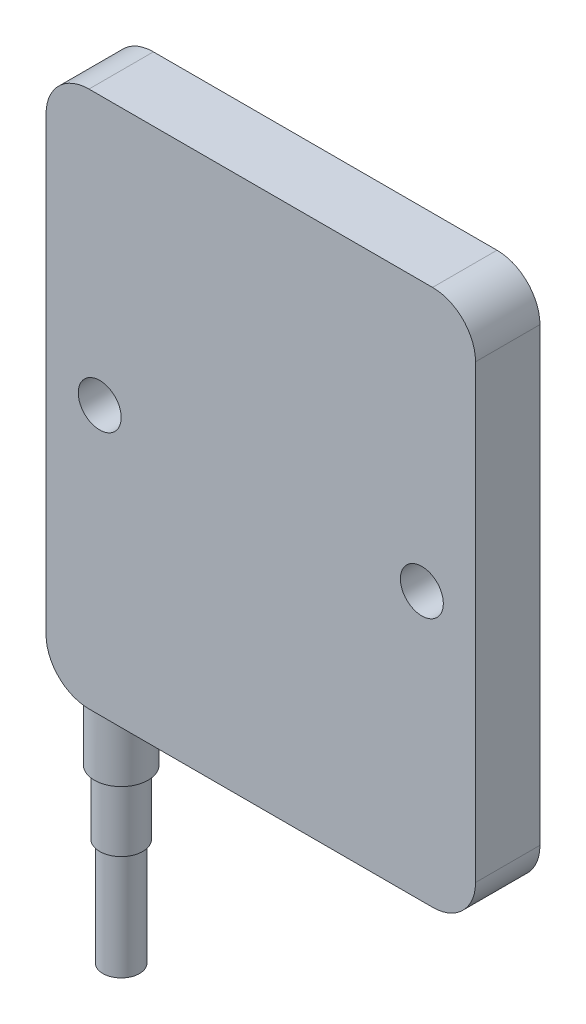
ISO-10303-21;
HEADER;
FILE_DESCRIPTION(('STEP AP214'),'2;1');
FILE_NAME('part.step','',(''),(''),'','','');
FILE_SCHEMA(('AUTOMOTIVE_DESIGN { 1 0 10303 214 1 1 1 1 }'));
ENDSEC;
DATA;
#1=APPLICATION_CONTEXT('core data for automotive mechanical design processes');
#2=APPLICATION_PROTOCOL_DEFINITION('international standard','automotive_design',2000,#1);
#3=PRODUCT_CONTEXT('',#1,'mechanical');
#4=PRODUCT('Part','Part','',(#3));
#5=PRODUCT_RELATED_PRODUCT_CATEGORY('part','',(#4));
#6=PRODUCT_DEFINITION_FORMATION('','',#4);
#7=PRODUCT_DEFINITION_CONTEXT('part definition',#1,'design');
#8=PRODUCT_DEFINITION('design','',#6,#7);
#9=PRODUCT_DEFINITION_SHAPE('','',#8);
#10=(LENGTH_UNIT() NAMED_UNIT(*) SI_UNIT(.MILLI.,.METRE.));
#11=(NAMED_UNIT(*) PLANE_ANGLE_UNIT() SI_UNIT($,.RADIAN.));
#12=(NAMED_UNIT(*) SI_UNIT($,.STERADIAN.) SOLID_ANGLE_UNIT());
#13=UNCERTAINTY_MEASURE_WITH_UNIT(LENGTH_MEASURE(1.E-05),#10,'distance_accuracy_value','');
#14=(GEOMETRIC_REPRESENTATION_CONTEXT(3) GLOBAL_UNCERTAINTY_ASSIGNED_CONTEXT((#13)) GLOBAL_UNIT_ASSIGNED_CONTEXT((#10,
#11,#12)) REPRESENTATION_CONTEXT('',''));
#15=CARTESIAN_POINT('',(0.,0.,0.));
#16=DIRECTION('',(0.,0.,1.));
#17=DIRECTION('',(1.,0.,0.));
#18=AXIS2_PLACEMENT_3D('',#15,#16,#17);
#19=CARTESIAN_POINT('',(31.,37.,3.));
#20=DIRECTION('',(0.,-1.,0.));
#21=DIRECTION('',(0.,0.,-1.));
#22=AXIS2_PLACEMENT_3D('',#19,#20,#21);
#23=PLANE('',#22);
#24=CARTESIAN_POINT('',(31.,37.,3.));
#25=DIRECTION('',(0.,-1.,0.));
#26=DIRECTION('',(0.,0.,-1.));
#27=AXIS2_PLACEMENT_3D('',#24,#25,#26);
#28=CIRCLE('',#27,1.7);
#29=CARTESIAN_POINT('',(31.,37.,1.3));
#30=VERTEX_POINT('',#29);
#31=EDGE_CURVE('E19',#30,#30,#28,.F.);
#32=ORIENTED_EDGE('',*,*,#31,.F.);
#33=EDGE_LOOP('',(#32));
#34=FACE_BOUND('',#33,.T.);
#35=ADVANCED_FACE('F16',(#34),#23,.T.);
#36=CARTESIAN_POINT('',(31.,47.,3.));
#37=DIRECTION('',(0.,-1.,0.));
#38=DIRECTION('',(0.,0.,-1.));
#39=AXIS2_PLACEMENT_3D('',#36,#37,#38);
#40=CYLINDRICAL_SURFACE('',#39,1.7);
#41=CARTESIAN_POINT('',(31.,47.,3.));
#42=DIRECTION('',(0.,-1.,0.));
#43=DIRECTION('',(0.,0.,-1.));
#44=AXIS2_PLACEMENT_3D('',#41,#42,#43);
#45=CIRCLE('',#44,1.7);
#46=CARTESIAN_POINT('',(31.,47.,1.3));
#47=VERTEX_POINT('',#46);
#48=EDGE_CURVE('E277',#47,#47,#45,.F.);
#49=ORIENTED_EDGE('',*,*,#48,.F.);
#50=EDGE_LOOP('',(#49));
#51=FACE_BOUND('',#50,.T.);
#52=ORIENTED_EDGE('',*,*,#31,.T.);
#53=EDGE_LOOP('',(#52));
#54=FACE_BOUND('',#53,.T.);
#55=ADVANCED_FACE('F294',(#51,#54),#40,.T.);
#56=CARTESIAN_POINT('',(31.,47.,3.));
#57=DIRECTION('',(0.,-1.,0.));
#58=DIRECTION('',(0.,0.,-1.));
#59=AXIS2_PLACEMENT_3D('',#56,#57,#58);
#60=PLANE('',#59);
#61=ORIENTED_EDGE('',*,*,#48,.T.);
#62=EDGE_LOOP('',(#61));
#63=FACE_BOUND('',#62,.T.);
#64=CARTESIAN_POINT('',(31.,47.,3.));
#65=DIRECTION('',(0.,-1.,0.));
#66=DIRECTION('',(0.,0.,-1.));
#67=AXIS2_PLACEMENT_3D('',#64,#65,#66);
#68=CIRCLE('',#67,2.);
#69=CARTESIAN_POINT('',(31.,47.,1.));
#70=VERTEX_POINT('',#69);
#71=EDGE_CURVE('E282',#70,#70,#68,.F.);
#72=ORIENTED_EDGE('',*,*,#71,.F.);
#73=EDGE_LOOP('',(#72));
#74=FACE_BOUND('',#73,.T.);
#75=ADVANCED_FACE('F291',(#63,#74),#60,.T.);
#76=CARTESIAN_POINT('',(31.,53.,3.));
#77=DIRECTION('',(0.,-1.,0.));
#78=DIRECTION('',(0.,0.,-1.));
#79=AXIS2_PLACEMENT_3D('',#76,#77,#78);
#80=CYLINDRICAL_SURFACE('',#79,2.);
#81=CARTESIAN_POINT('',(31.,53.,3.));
#82=DIRECTION('',(0.,-1.,0.));
#83=DIRECTION('',(0.,0.,-1.));
#84=AXIS2_PLACEMENT_3D('',#81,#82,#83);
#85=CIRCLE('',#84,2.);
#86=CARTESIAN_POINT('',(31.,53.,1.));
#87=VERTEX_POINT('',#86);
#88=EDGE_CURVE('E279',#87,#87,#85,.F.);
#89=ORIENTED_EDGE('',*,*,#88,.F.);
#90=EDGE_LOOP('',(#89));
#91=FACE_BOUND('',#90,.T.);
#92=ORIENTED_EDGE('',*,*,#71,.T.);
#93=EDGE_LOOP('',(#92));
#94=FACE_BOUND('',#93,.T.);
#95=ADVANCED_FACE('F312',(#91,#94),#80,.T.);
#96=CARTESIAN_POINT('',(47.,53.,3.));
#97=DIRECTION('',(0.,-1.,0.));
#98=DIRECTION('',(0.,0.,-1.));
#99=AXIS2_PLACEMENT_3D('',#96,#97,#98);
#100=PLANE('',#99);
#101=ORIENTED_EDGE('',*,*,#88,.T.);
#102=EDGE_LOOP('',(#101));
#103=FACE_BOUND('',#102,.T.);
#104=CARTESIAN_POINT('',(31.,53.,3.));
#105=DIRECTION('',(0.,-1.,0.));
#106=DIRECTION('',(0.,0.,-1.));
#107=AXIS2_PLACEMENT_3D('',#104,#105,#106);
#108=CIRCLE('',#107,2.5);
#109=CARTESIAN_POINT('',(31.,53.,0.5));
#110=VERTEX_POINT('',#109);
#111=EDGE_CURVE('E98',#110,#110,#108,.F.);
#112=ORIENTED_EDGE('',*,*,#111,.F.);
#113=EDGE_LOOP('',(#112));
#114=FACE_BOUND('',#113,.T.);
#115=ADVANCED_FACE('F203',(#103,#114),#100,.T.);
#116=CARTESIAN_POINT('',(31.,59.,3.));
#117=DIRECTION('',(0.,-1.,0.));
#118=DIRECTION('',(0.,0.,-1.));
#119=AXIS2_PLACEMENT_3D('',#116,#117,#118);
#120=CYLINDRICAL_SURFACE('',#119,2.5);
#121=ORIENTED_EDGE('',*,*,#111,.T.);
#122=EDGE_LOOP('',(#121));
#123=FACE_BOUND('',#122,.T.);
#124=CARTESIAN_POINT('',(31.,59.,3.));
#125=DIRECTION('',(0.,-1.,0.));
#126=DIRECTION('',(0.,0.,-1.));
#127=AXIS2_PLACEMENT_3D('',#124,#125,#126);
#128=CIRCLE('',#127,2.5);
#129=CARTESIAN_POINT('',(31.,59.,5.5));
#130=VERTEX_POINT('',#129);
#131=CARTESIAN_POINT('',(31.,59.,0.5));
#132=VERTEX_POINT('',#131);
#133=EDGE_CURVE('E177',#130,#132,#128,.F.);
#134=ORIENTED_EDGE('',*,*,#133,.F.);
#135=CARTESIAN_POINT('',(31.,59.,0.5));
#136=CARTESIAN_POINT('',(30.9361735592297,58.9999868498223,0.499988064096742));
#137=CARTESIAN_POINT('',(30.8723560174221,59.0015272998971,0.50244390518642));
#138=CARTESIAN_POINT('',(30.7452694405525,59.0076160664099,0.512198562252205));
#139=CARTESIAN_POINT('',(30.6820001332314,59.0121627915201,0.519494816033616));
#140=CARTESIAN_POINT('',(30.5568323847207,59.0241305257549,0.538782390953676));
#141=CARTESIAN_POINT('',(30.4949281598084,59.0315348888511,0.550746525548091));
#142=CARTESIAN_POINT('',(30.3725688336021,59.0490309810247,0.579198347348204));
#143=CARTESIAN_POINT('',(30.3121138602919,59.0591229464989,0.595686432476586));
#144=CARTESIAN_POINT('',(30.1337413935302,59.0930604567676,0.651581805091158));
#145=CARTESIAN_POINT('',(30.0184808572644,59.1206015056956,0.697473193781594));
#146=CARTESIAN_POINT('',(29.7976028763223,59.1832624583203,0.804692897539363));
#147=CARTESIAN_POINT('',(29.6919975647152,59.2183917162479,0.866040281380608));
#148=CARTESIAN_POINT('',(29.484045031304,59.2966009990152,1.00778039310689));
#149=CARTESIAN_POINT('',(29.3826193333566,59.3400904977199,1.08929719615567));
#150=CARTESIAN_POINT('',(29.1940060290669,59.4293835087592,1.26645992659057));
#151=CARTESIAN_POINT('',(29.106834610497,59.4751895756829,1.36212168612748));
#152=CARTESIAN_POINT('',(28.9371627753256,59.5713802984806,1.58004378484256));
#153=CARTESIAN_POINT('',(28.8568904942691,59.6215458020283,1.70415172865857));
#154=CARTESIAN_POINT('',(28.7185477291516,59.7133770776685,1.967060337296));
#155=CARTESIAN_POINT('',(28.660449489824,59.7550534449315,2.10584235470181));
#156=CARTESIAN_POINT('',(28.5775104048306,59.8166449299641,2.36979258078246));
#157=CARTESIAN_POINT('',(28.5486228575874,59.8390952102225,2.49307693947329));
#158=CARTESIAN_POINT('',(28.5098864142016,59.8695083437206,2.74425039037401));
#159=CARTESIAN_POINT('',(28.5000021122013,59.8774981373545,2.87213046614557));
#160=CARTESIAN_POINT('',(28.4999979443352,59.8775037876023,3.12444689986885));
#161=CARTESIAN_POINT('',(28.5093561331313,59.8699414880648,3.24888381461057));
#162=CARTESIAN_POINT('',(28.5460630632373,59.8410903452365,3.49349127110443));
#163=CARTESIAN_POINT('',(28.5734352810873,59.8197835903888,3.61365602953685));
#164=CARTESIAN_POINT('',(28.6442331090147,59.7670031013203,3.8455577683433));
#165=CARTESIAN_POINT('',(28.6875290073227,59.7356117688876,3.95735429600525));
#166=CARTESIAN_POINT('',(28.7885457150489,59.666350637947,4.17198834717447));
#167=CARTESIAN_POINT('',(28.8462706882365,59.6284789704186,4.27482327307814));
#168=CARTESIAN_POINT('',(28.9835203323726,59.5444092641395,4.48372746040888));
#169=CARTESIAN_POINT('',(29.0649294153665,59.4977754468736,4.58838453246912));
#170=CARTESIAN_POINT('',(29.2433670033234,59.4049486860931,4.78375495536729));
#171=CARTESIAN_POINT('',(29.3404101845982,59.3587562004615,4.87445504629784));
#172=CARTESIAN_POINT('',(29.5617453963305,59.2653688232534,5.05028774688047));
#173=CARTESIAN_POINT('',(29.6879152590335,59.2187331347732,5.13340742697823));
#174=CARTESIAN_POINT('',(29.8886166615291,59.1568557667167,5.24066780250304));
#175=CARTESIAN_POINT('',(29.9573929890703,59.1375825338051,5.27350772752684));
#176=CARTESIAN_POINT('',(30.0983506069519,59.1022713940412,5.33299496479512));
#177=CARTESIAN_POINT('',(30.1705293476463,59.0862311106328,5.35964682811881));
#178=CARTESIAN_POINT('',(30.3042746070834,59.0604917749287,5.40207277689933));
#179=CARTESIAN_POINT('',(30.3653764588617,59.0501697707252,5.4189441918785));
#180=CARTESIAN_POINT('',(30.4890606607313,59.0322746918861,5.44805546784212));
#181=CARTESIAN_POINT('',(30.551642638697,59.0247009339641,5.46029648009863));
#182=CARTESIAN_POINT('',(30.678224871769,59.0124543483624,5.48003711611805));
#183=CARTESIAN_POINT('',(30.7422314221147,59.0077993726294,5.48750756705181));
#184=CARTESIAN_POINT('',(30.8708222906272,59.0015640685454,5.49749720699123));
#185=CARTESIAN_POINT('',(30.9354069817046,58.9999858936958,5.50001292811604));
#186=CARTESIAN_POINT('',(31.,59.,5.5));
#187=B_SPLINE_CURVE_WITH_KNOTS('',3,(#135,#136,#137,#138,#139,#140,#141,#142,#143,#144,#145,
#146,#147,#148,#149,#150,#151,#152,#153,#154,#155,#156,#157,#158,#159,#160,#161,#162,#163,#164,
#165,#166,#167,#168,#169,#170,#171,#172,#173,#174,#175,#176,#177,#178,#179,#180,#181,#182,#183,
#184,#185,#186),.UNSPECIFIED.,.F.,.F.,(4,2,2,2,2,2,2,2,2,2,2,2,2,2,2,2,2,2,2,2,2,2,2,2,2,4),(0.,
0.191398869284106,0.382696505403774,0.572896234657114,0.763112699076406,1.14253468580791,
1.52242709508319,1.93242710776741,2.34288954810934,2.80889309242223,3.27431141165142,
3.65806801211889,4.04110892171344,4.41389712454096,4.78717212319738,5.15747149702545,
5.52787785101608,5.94790474268864,6.36832825174897,6.83979579215252,7.07532786634594,
7.31068616321663,7.50313058074982,7.69552711870357,7.88908920512617,8.08278672013315),.UNSPECIFIED.);
#188=EDGE_CURVE('E97',#132,#130,#187,.T.);
#189=ORIENTED_EDGE('',*,*,#188,.F.);
#190=EDGE_LOOP('',(#134,#189));
#191=FACE_BOUND('',#190,.T.);
#192=ADVANCED_FACE('F189',(#123,#191),#120,.T.);
#193=CARTESIAN_POINT('',(0.,0.,0.));
#194=DIRECTION('',(0.,0.,1.));
#195=DIRECTION('',(1.,0.,0.));
#196=AXIS2_PLACEMENT_3D('',#193,#194,#195);
#197=PLANE('',#196);
#198=CARTESIAN_POINT('',(32.,84.,0.));
#199=DIRECTION('',(0.,0.,1.));
#200=DIRECTION('',(1.,0.,0.));
#201=AXIS2_PLACEMENT_3D('',#198,#199,#200);
#202=CIRCLE('',#201,2.);
#203=CARTESIAN_POINT('',(34.,84.,0.));
#204=VERTEX_POINT('',#203);
#205=EDGE_CURVE('E158',#204,#204,#202,.T.);
#206=ORIENTED_EDGE('',*,*,#205,.T.);
#207=EDGE_LOOP('',(#206));
#208=FACE_BOUND('',#207,.T.);
#209=CARTESIAN_POINT('',(62.,84.,0.));
#210=DIRECTION('',(0.,0.,1.));
#211=DIRECTION('',(1.,0.,0.));
#212=AXIS2_PLACEMENT_3D('',#209,#210,#211);
#213=CIRCLE('',#212,2.);
#214=CARTESIAN_POINT('',(64.,84.,0.));
#215=VERTEX_POINT('',#214);
#216=EDGE_CURVE('E162',#215,#215,#213,.T.);
#217=ORIENTED_EDGE('',*,*,#216,.T.);
#218=EDGE_LOOP('',(#217));
#219=FACE_BOUND('',#218,.T.);
#220=CARTESIAN_POINT('',(31.,105.,0.));
#221=DIRECTION('',(0.,0.,1.));
#222=DIRECTION('',(1.,0.,0.));
#223=AXIS2_PLACEMENT_3D('',#220,#221,#222);
#224=CIRCLE('',#223,4.);
#225=CARTESIAN_POINT('',(31.,109.,0.));
#226=VERTEX_POINT('',#225);
#227=CARTESIAN_POINT('',(27.,105.,0.));
#228=VERTEX_POINT('',#227);
#229=EDGE_CURVE('E118',#226,#228,#224,.T.);
#230=ORIENTED_EDGE('',*,*,#229,.F.);
#231=DIRECTION('',(1.,0.,0.));
#232=VECTOR('',#231,1.);
#233=CARTESIAN_POINT('',(31.,109.,0.));
#234=LINE('',#233,#232);
#235=CARTESIAN_POINT('',(63.,109.,0.));
#236=VERTEX_POINT('',#235);
#237=EDGE_CURVE('E124',#236,#226,#234,.F.);
#238=ORIENTED_EDGE('',*,*,#237,.F.);
#239=CARTESIAN_POINT('',(63.,105.,0.));
#240=DIRECTION('',(0.,0.,1.));
#241=DIRECTION('',(1.,0.,0.));
#242=AXIS2_PLACEMENT_3D('',#239,#240,#241);
#243=CIRCLE('',#242,4.);
#244=CARTESIAN_POINT('',(67.,105.,0.));
#245=VERTEX_POINT('',#244);
#246=EDGE_CURVE('E168',#245,#236,#243,.T.);
#247=ORIENTED_EDGE('',*,*,#246,.F.);
#248=DIRECTION('',(0.,1.,0.));
#249=VECTOR('',#248,1.);
#250=CARTESIAN_POINT('',(67.,105.,0.));
#251=LINE('',#250,#249);
#252=CARTESIAN_POINT('',(67.,63.,0.));
#253=VERTEX_POINT('',#252);
#254=EDGE_CURVE('E130',#253,#245,#251,.T.);
#255=ORIENTED_EDGE('',*,*,#254,.F.);
#256=CARTESIAN_POINT('',(63.,63.,0.));
#257=DIRECTION('',(0.,0.,1.));
#258=DIRECTION('',(1.,0.,0.));
#259=AXIS2_PLACEMENT_3D('',#256,#257,#258);
#260=CIRCLE('',#259,4.);
#261=CARTESIAN_POINT('',(63.,59.,0.));
#262=VERTEX_POINT('',#261);
#263=EDGE_CURVE('E172',#262,#253,#260,.T.);
#264=ORIENTED_EDGE('',*,*,#263,.F.);
#265=DIRECTION('',(1.,0.,0.));
#266=VECTOR('',#265,1.);
#267=CARTESIAN_POINT('',(63.,59.,0.));
#268=LINE('',#267,#266);
#269=CARTESIAN_POINT('',(31.,59.,0.));
#270=VERTEX_POINT('',#269);
#271=EDGE_CURVE('E92',#270,#262,#268,.T.);
#272=ORIENTED_EDGE('',*,*,#271,.F.);
#273=CARTESIAN_POINT('',(31.,63.,0.));
#274=DIRECTION('',(0.,0.,1.));
#275=DIRECTION('',(1.,0.,0.));
#276=AXIS2_PLACEMENT_3D('',#273,#274,#275);
#277=CIRCLE('',#276,4.);
#278=CARTESIAN_POINT('',(27.,63.,0.));
#279=VERTEX_POINT('',#278);
#280=EDGE_CURVE('E86',#279,#270,#277,.T.);
#281=ORIENTED_EDGE('',*,*,#280,.F.);
#282=DIRECTION('',(0.,1.,0.));
#283=VECTOR('',#282,1.);
#284=CARTESIAN_POINT('',(27.,63.,0.));
#285=LINE('',#284,#283);
#286=EDGE_CURVE('E90',#228,#279,#285,.F.);
#287=ORIENTED_EDGE('',*,*,#286,.F.);
#288=EDGE_LOOP('',(#230,#238,#247,#255,#264,#272,#281,#287));
#289=FACE_BOUND('',#288,.T.);
#290=ADVANCED_FACE('F88',(#208,#219,#289),#197,.F.);
#291=CARTESIAN_POINT('',(31.,63.,0.));
#292=DIRECTION('',(0.,0.,1.));
#293=DIRECTION('',(1.,0.,0.));
#294=AXIS2_PLACEMENT_3D('',#291,#292,#293);
#295=CYLINDRICAL_SURFACE('',#294,4.);
#296=CARTESIAN_POINT('',(31.,63.,6.));
#297=DIRECTION('',(0.,0.,1.));
#298=DIRECTION('',(1.,0.,0.));
#299=AXIS2_PLACEMENT_3D('',#296,#297,#298);
#300=CIRCLE('',#299,4.);
#301=CARTESIAN_POINT('',(27.,63.,6.));
#302=VERTEX_POINT('',#301);
#303=CARTESIAN_POINT('',(31.,59.,6.));
#304=VERTEX_POINT('',#303);
#305=EDGE_CURVE('E104',#302,#304,#300,.T.);
#306=ORIENTED_EDGE('',*,*,#305,.F.);
#307=DIRECTION('',(0.,0.,1.));
#308=VECTOR('',#307,1.);
#309=CARTESIAN_POINT('',(27.,63.,0.));
#310=LINE('',#309,#308);
#311=EDGE_CURVE('E101',#279,#302,#310,.T.);
#312=ORIENTED_EDGE('',*,*,#311,.F.);
#313=ORIENTED_EDGE('',*,*,#280,.T.);
#314=DIRECTION('',(0.,0.,-1.));
#315=VECTOR('',#314,1.);
#316=CARTESIAN_POINT('',(31.,59.,0.));
#317=LINE('',#316,#315);
#318=EDGE_CURVE('E176',#132,#270,#317,.T.);
#319=ORIENTED_EDGE('',*,*,#318,.F.);
#320=ORIENTED_EDGE('',*,*,#188,.T.);
#321=DIRECTION('',(0.,0.,-1.));
#322=VECTOR('',#321,1.);
#323=CARTESIAN_POINT('',(31.,59.,0.));
#324=LINE('',#323,#322);
#325=EDGE_CURVE('E122',#304,#130,#324,.T.);
#326=ORIENTED_EDGE('',*,*,#325,.F.);
#327=EDGE_LOOP('',(#306,#312,#313,#319,#320,#326));
#328=FACE_BOUND('',#327,.T.);
#329=ADVANCED_FACE('F102',(#328),#295,.T.);
#330=CARTESIAN_POINT('',(63.,59.,0.));
#331=DIRECTION('',(0.,-1.,0.));
#332=DIRECTION('',(0.,0.,-1.));
#333=AXIS2_PLACEMENT_3D('',#330,#331,#332);
#334=PLANE('',#333);
#335=ORIENTED_EDGE('',*,*,#133,.T.);
#336=ORIENTED_EDGE('',*,*,#318,.T.);
#337=ORIENTED_EDGE('',*,*,#271,.T.);
#338=DIRECTION('',(0.,0.,1.));
#339=VECTOR('',#338,1.);
#340=CARTESIAN_POINT('',(63.,59.,0.));
#341=LINE('',#340,#339);
#342=CARTESIAN_POINT('',(63.,59.,6.));
#343=VERTEX_POINT('',#342);
#344=EDGE_CURVE('E135',#343,#262,#341,.F.);
#345=ORIENTED_EDGE('',*,*,#344,.F.);
#346=DIRECTION('',(1.,0.,0.));
#347=VECTOR('',#346,1.);
#348=CARTESIAN_POINT('',(0.,59.,6.));
#349=LINE('',#348,#347);
#350=EDGE_CURVE('E155',#304,#343,#349,.T.);
#351=ORIENTED_EDGE('',*,*,#350,.F.);
#352=ORIENTED_EDGE('',*,*,#325,.T.);
#353=EDGE_LOOP('',(#335,#336,#337,#345,#351,#352));
#354=FACE_BOUND('',#353,.T.);
#355=ADVANCED_FACE('F196',(#354),#334,.T.);
#356=CARTESIAN_POINT('',(63.,63.,0.));
#357=DIRECTION('',(0.,0.,1.));
#358=DIRECTION('',(1.,0.,0.));
#359=AXIS2_PLACEMENT_3D('',#356,#357,#358);
#360=CYLINDRICAL_SURFACE('',#359,4.);
#361=CARTESIAN_POINT('',(63.,63.,6.));
#362=DIRECTION('',(0.,0.,1.));
#363=DIRECTION('',(1.,0.,0.));
#364=AXIS2_PLACEMENT_3D('',#361,#362,#363);
#365=CIRCLE('',#364,4.);
#366=CARTESIAN_POINT('',(67.,63.,6.));
#367=VERTEX_POINT('',#366);
#368=EDGE_CURVE('E151',#343,#367,#365,.T.);
#369=ORIENTED_EDGE('',*,*,#368,.F.);
#370=ORIENTED_EDGE('',*,*,#344,.T.);
#371=ORIENTED_EDGE('',*,*,#263,.T.);
#372=DIRECTION('',(0.,0.,-1.));
#373=VECTOR('',#372,1.);
#374=CARTESIAN_POINT('',(67.,63.,0.));
#375=LINE('',#374,#373);
#376=EDGE_CURVE('E134',#367,#253,#375,.T.);
#377=ORIENTED_EDGE('',*,*,#376,.F.);
#378=EDGE_LOOP('',(#369,#370,#371,#377));
#379=FACE_BOUND('',#378,.T.);
#380=ADVANCED_FACE('F236',(#379),#360,.T.);
#381=CARTESIAN_POINT('',(67.,105.,0.));
#382=DIRECTION('',(1.,0.,0.));
#383=DIRECTION('',(0.,0.,-1.));
#384=AXIS2_PLACEMENT_3D('',#381,#382,#383);
#385=PLANE('',#384);
#386=DIRECTION('',(0.,1.,0.));
#387=VECTOR('',#386,1.);
#388=CARTESIAN_POINT('',(67.,0.,6.));
#389=LINE('',#388,#387);
#390=CARTESIAN_POINT('',(67.,105.,6.));
#391=VERTEX_POINT('',#390);
#392=EDGE_CURVE('E150',#367,#391,#389,.T.);
#393=ORIENTED_EDGE('',*,*,#392,.F.);
#394=ORIENTED_EDGE('',*,*,#376,.T.);
#395=ORIENTED_EDGE('',*,*,#254,.T.);
#396=DIRECTION('',(0.,0.,1.));
#397=VECTOR('',#396,1.);
#398=CARTESIAN_POINT('',(67.,105.,0.));
#399=LINE('',#398,#397);
#400=EDGE_CURVE('E129',#391,#245,#399,.F.);
#401=ORIENTED_EDGE('',*,*,#400,.F.);
#402=EDGE_LOOP('',(#393,#394,#395,#401));
#403=FACE_BOUND('',#402,.T.);
#404=ADVANCED_FACE('F233',(#403),#385,.T.);
#405=CARTESIAN_POINT('',(63.,105.,0.));
#406=DIRECTION('',(0.,0.,1.));
#407=DIRECTION('',(1.,0.,0.));
#408=AXIS2_PLACEMENT_3D('',#405,#406,#407);
#409=CYLINDRICAL_SURFACE('',#408,4.);
#410=CARTESIAN_POINT('',(63.,105.,6.));
#411=DIRECTION('',(0.,0.,1.));
#412=DIRECTION('',(1.,0.,0.));
#413=AXIS2_PLACEMENT_3D('',#410,#411,#412);
#414=CIRCLE('',#413,4.);
#415=CARTESIAN_POINT('',(63.,109.,6.));
#416=VERTEX_POINT('',#415);
#417=EDGE_CURVE('E146',#391,#416,#414,.T.);
#418=ORIENTED_EDGE('',*,*,#417,.F.);
#419=ORIENTED_EDGE('',*,*,#400,.T.);
#420=ORIENTED_EDGE('',*,*,#246,.T.);
#421=DIRECTION('',(0.,0.,1.));
#422=VECTOR('',#421,1.);
#423=CARTESIAN_POINT('',(63.,109.,0.));
#424=LINE('',#423,#422);
#425=EDGE_CURVE('E128',#416,#236,#424,.F.);
#426=ORIENTED_EDGE('',*,*,#425,.F.);
#427=EDGE_LOOP('',(#418,#419,#420,#426));
#428=FACE_BOUND('',#427,.T.);
#429=ADVANCED_FACE('F229',(#428),#409,.T.);
#430=CARTESIAN_POINT('',(31.,109.,0.));
#431=DIRECTION('',(0.,1.,0.));
#432=DIRECTION('',(0.,0.,1.));
#433=AXIS2_PLACEMENT_3D('',#430,#431,#432);
#434=PLANE('',#433);
#435=DIRECTION('',(1.,0.,0.));
#436=VECTOR('',#435,1.);
#437=CARTESIAN_POINT('',(0.,109.,6.));
#438=LINE('',#437,#436);
#439=CARTESIAN_POINT('',(31.,109.,6.));
#440=VERTEX_POINT('',#439);
#441=EDGE_CURVE('E145',#416,#440,#438,.F.);
#442=ORIENTED_EDGE('',*,*,#441,.F.);
#443=ORIENTED_EDGE('',*,*,#425,.T.);
#444=ORIENTED_EDGE('',*,*,#237,.T.);
#445=DIRECTION('',(0.,0.,1.));
#446=VECTOR('',#445,1.);
#447=CARTESIAN_POINT('',(31.,109.,0.));
#448=LINE('',#447,#446);
#449=EDGE_CURVE('E111',#440,#226,#448,.F.);
#450=ORIENTED_EDGE('',*,*,#449,.F.);
#451=EDGE_LOOP('',(#442,#443,#444,#450));
#452=FACE_BOUND('',#451,.T.);
#453=ADVANCED_FACE('F226',(#452),#434,.T.);
#454=CARTESIAN_POINT('',(31.,105.,0.));
#455=DIRECTION('',(0.,0.,1.));
#456=DIRECTION('',(1.,0.,0.));
#457=AXIS2_PLACEMENT_3D('',#454,#455,#456);
#458=CYLINDRICAL_SURFACE('',#457,4.);
#459=CARTESIAN_POINT('',(31.,105.,6.));
#460=DIRECTION('',(0.,0.,1.));
#461=DIRECTION('',(1.,0.,0.));
#462=AXIS2_PLACEMENT_3D('',#459,#460,#461);
#463=CIRCLE('',#462,4.);
#464=CARTESIAN_POINT('',(27.,105.,6.));
#465=VERTEX_POINT('',#464);
#466=EDGE_CURVE('E142',#440,#465,#463,.T.);
#467=ORIENTED_EDGE('',*,*,#466,.F.);
#468=ORIENTED_EDGE('',*,*,#449,.T.);
#469=ORIENTED_EDGE('',*,*,#229,.T.);
#470=DIRECTION('',(0.,0.,1.));
#471=VECTOR('',#470,1.);
#472=CARTESIAN_POINT('',(27.,105.,0.));
#473=LINE('',#472,#471);
#474=EDGE_CURVE('E35',#465,#228,#473,.F.);
#475=ORIENTED_EDGE('',*,*,#474,.F.);
#476=EDGE_LOOP('',(#467,#468,#469,#475));
#477=FACE_BOUND('',#476,.T.);
#478=ADVANCED_FACE('F223',(#477),#458,.T.);
#479=CARTESIAN_POINT('',(27.,63.,0.));
#480=DIRECTION('',(-1.,0.,0.));
#481=DIRECTION('',(0.,0.,1.));
#482=AXIS2_PLACEMENT_3D('',#479,#480,#481);
#483=PLANE('',#482);
#484=DIRECTION('',(0.,1.,0.));
#485=VECTOR('',#484,1.);
#486=CARTESIAN_POINT('',(27.,0.,6.));
#487=LINE('',#486,#485);
#488=EDGE_CURVE('E141',#465,#302,#487,.F.);
#489=ORIENTED_EDGE('',*,*,#488,.F.);
#490=ORIENTED_EDGE('',*,*,#474,.T.);
#491=ORIENTED_EDGE('',*,*,#286,.T.);
#492=ORIENTED_EDGE('',*,*,#311,.T.);
#493=EDGE_LOOP('',(#489,#490,#491,#492));
#494=FACE_BOUND('',#493,.T.);
#495=ADVANCED_FACE('F109',(#494),#483,.T.);
#496=CARTESIAN_POINT('',(62.,84.,0.));
#497=DIRECTION('',(0.,0.,1.));
#498=DIRECTION('',(1.,0.,0.));
#499=AXIS2_PLACEMENT_3D('',#496,#497,#498);
#500=CYLINDRICAL_SURFACE('',#499,2.);
#501=CARTESIAN_POINT('',(62.,84.,6.));
#502=DIRECTION('',(0.,0.,1.));
#503=DIRECTION('',(1.,0.,0.));
#504=AXIS2_PLACEMENT_3D('',#501,#502,#503);
#505=CIRCLE('',#504,2.);
#506=CARTESIAN_POINT('',(64.,84.,6.));
#507=VERTEX_POINT('',#506);
#508=EDGE_CURVE('E26',#507,#507,#505,.F.);
#509=ORIENTED_EDGE('',*,*,#508,.F.);
#510=EDGE_LOOP('',(#509));
#511=FACE_BOUND('',#510,.T.);
#512=ORIENTED_EDGE('',*,*,#216,.F.);
#513=EDGE_LOOP('',(#512));
#514=FACE_BOUND('',#513,.T.);
#515=ADVANCED_FACE('F213',(#511,#514),#500,.F.);
#516=CARTESIAN_POINT('',(32.,84.,0.));
#517=DIRECTION('',(0.,0.,1.));
#518=DIRECTION('',(1.,0.,0.));
#519=AXIS2_PLACEMENT_3D('',#516,#517,#518);
#520=CYLINDRICAL_SURFACE('',#519,2.);
#521=CARTESIAN_POINT('',(32.,84.,6.));
#522=DIRECTION('',(0.,0.,1.));
#523=DIRECTION('',(1.,0.,0.));
#524=AXIS2_PLACEMENT_3D('',#521,#522,#523);
#525=CIRCLE('',#524,2.);
#526=CARTESIAN_POINT('',(34.,84.,6.));
#527=VERTEX_POINT('',#526);
#528=EDGE_CURVE('E11',#527,#527,#525,.F.);
#529=ORIENTED_EDGE('',*,*,#528,.F.);
#530=EDGE_LOOP('',(#529));
#531=FACE_BOUND('',#530,.T.);
#532=ORIENTED_EDGE('',*,*,#205,.F.);
#533=EDGE_LOOP('',(#532));
#534=FACE_BOUND('',#533,.T.);
#535=ADVANCED_FACE('F208',(#531,#534),#520,.F.);
#536=CARTESIAN_POINT('',(0.,0.,6.));
#537=DIRECTION('',(0.,0.,1.));
#538=DIRECTION('',(1.,0.,0.));
#539=AXIS2_PLACEMENT_3D('',#536,#537,#538);
#540=PLANE('',#539);
#541=ORIENTED_EDGE('',*,*,#528,.T.);
#542=EDGE_LOOP('',(#541));
#543=FACE_BOUND('',#542,.T.);
#544=ORIENTED_EDGE('',*,*,#508,.T.);
#545=EDGE_LOOP('',(#544));
#546=FACE_BOUND('',#545,.T.);
#547=ORIENTED_EDGE('',*,*,#466,.T.);
#548=ORIENTED_EDGE('',*,*,#488,.T.);
#549=ORIENTED_EDGE('',*,*,#305,.T.);
#550=ORIENTED_EDGE('',*,*,#350,.T.);
#551=ORIENTED_EDGE('',*,*,#368,.T.);
#552=ORIENTED_EDGE('',*,*,#392,.T.);
#553=ORIENTED_EDGE('',*,*,#417,.T.);
#554=ORIENTED_EDGE('',*,*,#441,.T.);
#555=EDGE_LOOP('',(#547,#548,#549,#550,#551,#552,#553,#554));
#556=FACE_BOUND('',#555,.T.);
#557=ADVANCED_FACE('F206',(#543,#546,#556),#540,.T.);
#558=CLOSED_SHELL('',(#35,#55,#75,#95,#115,#192,#290,#329,#355,#380,#404,#429,#453,#478,#495,
#515,#535,#557));
#559=MANIFOLD_SOLID_BREP('B1',#558);
#560=ADVANCED_BREP_SHAPE_REPRESENTATION('',(#18,#559),#14);
#561=SHAPE_DEFINITION_REPRESENTATION(#9,#560);
ENDSEC;
END-ISO-10303-21;
